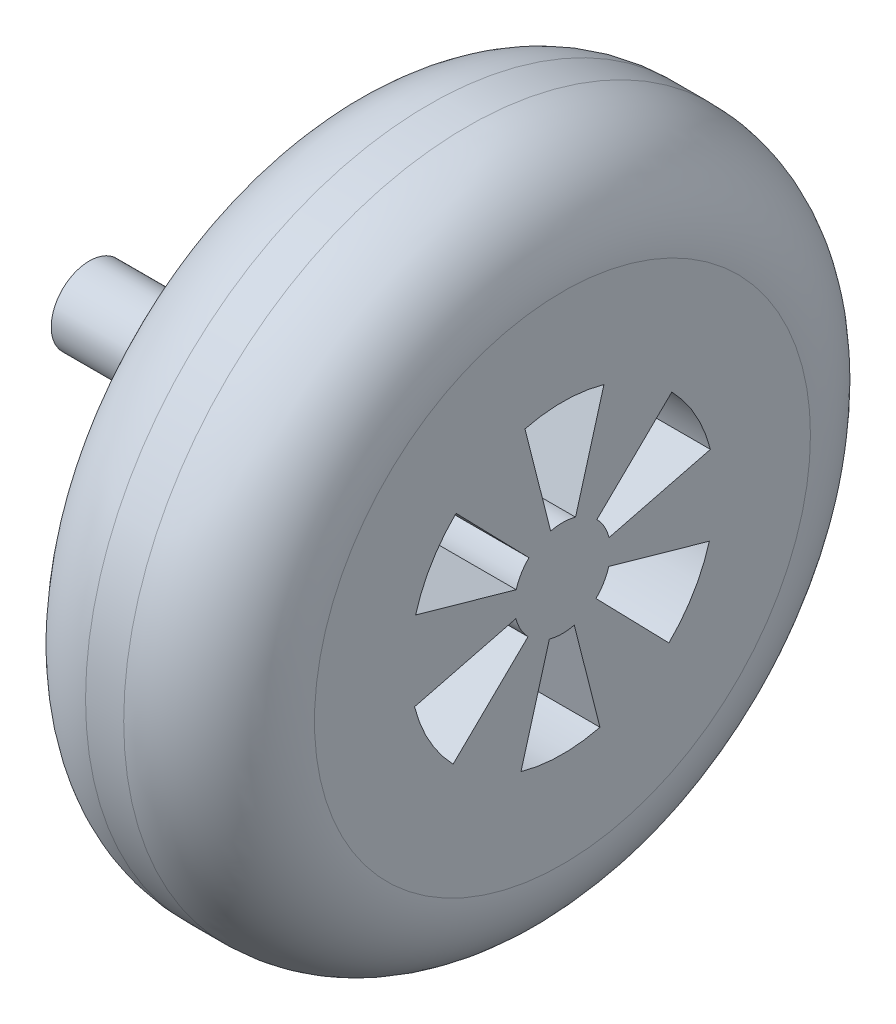
ISO-10303-21;
HEADER;
FILE_DESCRIPTION(('STEP AP214'),'2;1');
FILE_NAME('part.step','',(''),(''),'','','');
FILE_SCHEMA(('AUTOMOTIVE_DESIGN { 1 0 10303 214 1 1 1 1 }'));
ENDSEC;
DATA;
#1=APPLICATION_CONTEXT('core data for automotive mechanical design processes');
#2=APPLICATION_PROTOCOL_DEFINITION('international standard','automotive_design',2000,#1);
#3=PRODUCT_CONTEXT('',#1,'mechanical');
#4=PRODUCT('Part','Part','',(#3));
#5=PRODUCT_RELATED_PRODUCT_CATEGORY('part','',(#4));
#6=PRODUCT_DEFINITION_FORMATION('','',#4);
#7=PRODUCT_DEFINITION_CONTEXT('part definition',#1,'design');
#8=PRODUCT_DEFINITION('design','',#6,#7);
#9=PRODUCT_DEFINITION_SHAPE('','',#8);
#10=(LENGTH_UNIT() NAMED_UNIT(*) SI_UNIT(.MILLI.,.METRE.));
#11=(NAMED_UNIT(*) PLANE_ANGLE_UNIT() SI_UNIT($,.RADIAN.));
#12=(NAMED_UNIT(*) SI_UNIT($,.STERADIAN.) SOLID_ANGLE_UNIT());
#13=UNCERTAINTY_MEASURE_WITH_UNIT(LENGTH_MEASURE(1.E-05),#10,'distance_accuracy_value','');
#14=(GEOMETRIC_REPRESENTATION_CONTEXT(3) GLOBAL_UNCERTAINTY_ASSIGNED_CONTEXT((#13)) GLOBAL_UNIT_ASSIGNED_CONTEXT((#10,
#11,#12)) REPRESENTATION_CONTEXT('',''));
#15=CARTESIAN_POINT('',(0.,0.,0.));
#16=DIRECTION('',(0.,0.,1.));
#17=DIRECTION('',(1.,0.,0.));
#18=AXIS2_PLACEMENT_3D('',#15,#16,#17);
#19=CARTESIAN_POINT('',(60.,0.,0.));
#20=DIRECTION('',(-1.,0.,0.));
#21=DIRECTION('',(0.,0.,1.));
#22=AXIS2_PLACEMENT_3D('',#19,#20,#21);
#23=CYLINDRICAL_SURFACE('',#22,90.);
#24=CARTESIAN_POINT('',(35.,0.,0.));
#25=DIRECTION('',(1.,0.,0.));
#26=DIRECTION('',(0.,0.,-1.));
#27=AXIS2_PLACEMENT_3D('',#24,#25,#26);
#28=CIRCLE('',#27,90.);
#29=CARTESIAN_POINT('',(35.,0.,-90.));
#30=VERTEX_POINT('',#29);
#31=EDGE_CURVE('E385',#30,#30,#28,.F.);
#32=ORIENTED_EDGE('',*,*,#31,.T.);
#33=EDGE_LOOP('',(#32));
#34=FACE_BOUND('',#33,.T.);
#35=CARTESIAN_POINT('',(25.,0.,0.));
#36=DIRECTION('',(1.,0.,0.));
#37=DIRECTION('',(0.,0.,-1.));
#38=AXIS2_PLACEMENT_3D('',#35,#36,#37);
#39=CIRCLE('',#38,90.);
#40=CARTESIAN_POINT('',(25.,0.,-90.));
#41=VERTEX_POINT('',#40);
#42=EDGE_CURVE('E382',#41,#41,#39,.T.);
#43=ORIENTED_EDGE('',*,*,#42,.T.);
#44=EDGE_LOOP('',(#43));
#45=FACE_BOUND('',#44,.T.);
#46=ADVANCED_FACE('F136',(#34,#45),#23,.T.);
#47=CARTESIAN_POINT('',(60.,0.,0.));
#48=DIRECTION('',(1.,0.,0.));
#49=DIRECTION('',(0.,0.,-1.));
#50=AXIS2_PLACEMENT_3D('',#47,#48,#49);
#51=PLANE('',#50);
#52=DIRECTION('',(0.,0.962341280026266,-0.271844184704048));
#53=VECTOR('',#52,1.);
#54=CARTESIAN_POINT('',(60.,0.,0.));
#55=LINE('',#54,#53);
#56=CARTESIAN_POINT('',(60.,12.1213226702997,-3.424056670158));
#57=VERTEX_POINT('',#56);
#58=CARTESIAN_POINT('',(60.,38.4936512010506,-10.8737673881619));
#59=VERTEX_POINT('',#58);
#60=EDGE_CURVE('E340',#57,#59,#55,.T.);
#61=ORIENTED_EDGE('',*,*,#60,.F.);
#62=CARTESIAN_POINT('',(60.,0.,0.));
#63=DIRECTION('',(1.,0.,0.));
#64=DIRECTION('',(0.,0.,-1.));
#65=AXIS2_PLACEMENT_3D('',#62,#63,#64);
#66=CIRCLE('',#65,12.5956590680272);
#67=CARTESIAN_POINT('',(60.,12.2094016950268,3.0953412747955));
#68=VERTEX_POINT('',#67);
#69=EDGE_CURVE('E308',#57,#68,#66,.T.);
#70=ORIENTED_EDGE('',*,*,#69,.T.);
#71=DIRECTION('',(0.,0.969334087965204,0.24574667018836));
#72=VECTOR('',#71,1.);
#73=CARTESIAN_POINT('',(60.,0.,0.));
#74=LINE('',#73,#72);
#75=CARTESIAN_POINT('',(60.,38.7733635186082,9.82986680753438));
#76=VERTEX_POINT('',#75);
#77=EDGE_CURVE('E363',#68,#76,#74,.T.);
#78=ORIENTED_EDGE('',*,*,#77,.T.);
#79=CARTESIAN_POINT('',(60.,0.,0.));
#80=DIRECTION('',(1.,0.,0.));
#81=DIRECTION('',(0.,0.,-1.));
#82=AXIS2_PLACEMENT_3D('',#79,#80,#81);
#83=CIRCLE('',#82,40.);
#84=EDGE_CURVE('E370',#59,#76,#83,.T.);
#85=ORIENTED_EDGE('',*,*,#84,.F.);
#86=EDGE_LOOP('',(#61,#70,#78,#85));
#87=FACE_BOUND('',#86,.T.);
#88=DIRECTION('',(0.,0.716594609837904,0.69748990326116));
#89=VECTOR('',#88,1.);
#90=CARTESIAN_POINT('',(60.,1.15550426451895E-13,-1.18715428528426E-13));
#91=LINE('',#90,#89);
#92=CARTESIAN_POINT('',(60.,9.02598139550432,8.78534502486873));
#93=VERTEX_POINT('',#92);
#94=CARTESIAN_POINT('',(60.,28.6637843935163,27.8995961304463));
#95=VERTEX_POINT('',#94);
#96=EDGE_CURVE('E480',#93,#95,#91,.T.);
#97=ORIENTED_EDGE('',*,*,#96,.F.);
#98=CARTESIAN_POINT('',(60.,3.42405667015756,12.1213226702999));
#99=VERTEX_POINT('',#98);
#100=EDGE_CURVE('E620',#93,#99,#66,.T.);
#101=ORIENTED_EDGE('',*,*,#100,.T.);
#102=DIRECTION('',(0.,0.271844184704046,0.962341280026266));
#103=VECTOR('',#102,1.);
#104=CARTESIAN_POINT('',(60.,-4.12758163562285E-13,1.16596792408683E-13));
#105=LINE('',#104,#103);
#106=CARTESIAN_POINT('',(60.,10.8737673881612,38.49365120105));
#107=VERTEX_POINT('',#106);
#108=EDGE_CURVE('E474',#99,#107,#105,.T.);
#109=ORIENTED_EDGE('',*,*,#108,.T.);
#110=CARTESIAN_POINT('',(60.,0.,0.));
#111=DIRECTION('',(1.,0.,0.));
#112=DIRECTION('',(0.,0.,-1.));
#113=AXIS2_PLACEMENT_3D('',#110,#111,#112);
#114=CIRCLE('',#113,40.);
#115=EDGE_CURVE('E477',#95,#107,#114,.T.);
#116=ORIENTED_EDGE('',*,*,#115,.F.);
#117=EDGE_LOOP('',(#97,#101,#109,#116));
#118=FACE_BOUND('',#117,.T.);
#119=DIRECTION('',(0.,-0.245746670188359,0.969334087965204));
#120=VECTOR('',#119,1.);
#121=CARTESIAN_POINT('',(60.,-7.17171094242255E-13,-1.818180238924E-13));
#122=LINE('',#121,#120);
#123=CARTESIAN_POINT('',(60.,-3.09534127479621,12.2094016950266));
#124=VERTEX_POINT('',#123);
#125=CARTESIAN_POINT('',(60.,-9.82986680753507,38.773363518608));
#126=VERTEX_POINT('',#125);
#127=EDGE_CURVE('E460',#124,#126,#122,.T.);
#128=ORIENTED_EDGE('',*,*,#127,.F.);
#129=CARTESIAN_POINT('',(60.,-8.78534502486973,9.02598139550334));
#130=VERTEX_POINT('',#129);
#131=EDGE_CURVE('E622',#124,#130,#66,.T.);
#132=ORIENTED_EDGE('',*,*,#131,.T.);
#133=DIRECTION('',(0.,-0.697489903261158,0.716594609837906));
#134=VECTOR('',#133,1.);
#135=CARTESIAN_POINT('',(60.,-9.17402997423861E-13,-8.92944656769615E-13));
#136=LINE('',#135,#134);
#137=CARTESIAN_POINT('',(60.,-27.8995961304467,28.6637843935148));
#138=VERTEX_POINT('',#137);
#139=EDGE_CURVE('E454',#130,#138,#136,.T.);
#140=ORIENTED_EDGE('',*,*,#139,.T.);
#141=CARTESIAN_POINT('',(60.,0.,0.));
#142=DIRECTION('',(1.,0.,0.));
#143=DIRECTION('',(0.,0.,-1.));
#144=AXIS2_PLACEMENT_3D('',#141,#142,#143);
#145=CIRCLE('',#144,40.);
#146=EDGE_CURVE('E457',#126,#138,#145,.T.);
#147=ORIENTED_EDGE('',*,*,#146,.F.);
#148=EDGE_LOOP('',(#128,#132,#140,#147));
#149=FACE_BOUND('',#148,.T.);
#150=DIRECTION('',(0.,-0.962341280026266,0.271844184704048));
#151=VECTOR('',#150,1.);
#152=CARTESIAN_POINT('',(60.,-4.01309890150818E-13,-1.42065600481903E-12));
#153=LINE('',#152,#151);
#154=CARTESIAN_POINT('',(60.,-12.1213226703001,3.42405667015658));
#155=VERTEX_POINT('',#154);
#156=CARTESIAN_POINT('',(60.,-38.493651201051,10.8737673881605));
#157=VERTEX_POINT('',#156);
#158=EDGE_CURVE('E158',#155,#157,#153,.T.);
#159=ORIENTED_EDGE('',*,*,#158,.F.);
#160=CARTESIAN_POINT('',(60.,-12.2094016950264,-3.09534127479715));
#161=VERTEX_POINT('',#160);
#162=EDGE_CURVE('E152',#155,#161,#66,.T.);
#163=ORIENTED_EDGE('',*,*,#162,.T.);
#164=DIRECTION('',(0.,-0.969334087965204,-0.24574667018836));
#165=VECTOR('',#164,1.);
#166=CARTESIAN_POINT('',(60.,4.18842223855297E-13,-1.65209988298479E-12));
#167=LINE('',#166,#165);
#168=CARTESIAN_POINT('',(60.,-38.7733635186077,-9.82986680753604));
#169=VERTEX_POINT('',#168);
#170=EDGE_CURVE('E435',#161,#169,#167,.T.);
#171=ORIENTED_EDGE('',*,*,#170,.T.);
#172=CARTESIAN_POINT('',(60.,0.,0.));
#173=DIRECTION('',(1.,0.,0.));
#174=DIRECTION('',(0.,0.,-1.));
#175=AXIS2_PLACEMENT_3D('',#172,#173,#174);
#176=CIRCLE('',#175,40.);
#177=EDGE_CURVE('E438',#157,#169,#176,.T.);
#178=ORIENTED_EDGE('',*,*,#177,.F.);
#179=EDGE_LOOP('',(#159,#163,#171,#178));
#180=FACE_BOUND('',#179,.T.);
#181=DIRECTION('',(0.,-0.716594609837907,-0.697489903261157));
#182=VECTOR('',#181,1.);
#183=CARTESIAN_POINT('',(60.,1.02906426908205E-12,-1.05725101532384E-12));
#184=LINE('',#183,#182);
#185=CARTESIAN_POINT('',(60.,-9.02598139550322,-8.78534502486986));
#186=VERTEX_POINT('',#185);
#187=CARTESIAN_POINT('',(60.,-28.6637843935153,-27.8995961304473));
#188=VERTEX_POINT('',#187);
#189=EDGE_CURVE('E351',#186,#188,#184,.T.);
#190=ORIENTED_EDGE('',*,*,#189,.F.);
#191=CARTESIAN_POINT('',(60.,-3.42405667015675,-12.1213226703001));
#192=VERTEX_POINT('',#191);
#193=EDGE_CURVE('E310',#186,#192,#66,.T.);
#194=ORIENTED_EDGE('',*,*,#193,.T.);
#195=DIRECTION('',(0.,-0.271844184704046,-0.962341280026266));
#196=VECTOR('',#195,1.);
#197=CARTESIAN_POINT('',(60.,1.22951016163245E-12,-3.47314611158726E-13));
#198=LINE('',#197,#196);
#199=CARTESIAN_POINT('',(60.,-10.8737673881608,-38.4936512010517));
#200=VERTEX_POINT('',#199);
#201=EDGE_CURVE('E346',#192,#200,#198,.T.);
#202=ORIENTED_EDGE('',*,*,#201,.T.);
#203=CARTESIAN_POINT('',(60.,0.,0.));
#204=DIRECTION('',(1.,0.,0.));
#205=DIRECTION('',(0.,0.,-1.));
#206=AXIS2_PLACEMENT_3D('',#203,#204,#205);
#207=CIRCLE('',#206,40.);
#208=EDGE_CURVE('E353',#188,#200,#207,.T.);
#209=ORIENTED_EDGE('',*,*,#208,.F.);
#210=EDGE_LOOP('',(#190,#194,#202,#209));
#211=FACE_BOUND('',#210,.T.);
#212=CARTESIAN_POINT('',(60.,3.0953412747962,-12.2094016950266));
#213=VERTEX_POINT('',#212);
#214=CARTESIAN_POINT('',(60.,8.78534502486912,-9.02598139550394));
#215=VERTEX_POINT('',#214);
#216=EDGE_CURVE('E297',#213,#215,#66,.T.);
#217=ORIENTED_EDGE('',*,*,#216,.T.);
#218=DIRECTION('',(0.,0.697489903261157,-0.716594609837906));
#219=VECTOR('',#218,1.);
#220=CARTESIAN_POINT('',(60.,3.04557905648843E-13,2.96438266813761E-13));
#221=LINE('',#220,#219);
#222=CARTESIAN_POINT('',(60.,27.8995961304471,-28.6637843935165));
#223=VERTEX_POINT('',#222);
#224=EDGE_CURVE('E327',#215,#223,#221,.T.);
#225=ORIENTED_EDGE('',*,*,#224,.T.);
#226=CARTESIAN_POINT('',(60.,0.,0.));
#227=DIRECTION('',(1.,0.,0.));
#228=DIRECTION('',(0.,0.,-1.));
#229=AXIS2_PLACEMENT_3D('',#226,#227,#228);
#230=CIRCLE('',#229,40.);
#231=CARTESIAN_POINT('',(60.,9.82986680753505,-38.773363518608));
#232=VERTEX_POINT('',#231);
#233=EDGE_CURVE('E324',#232,#223,#230,.T.);
#234=ORIENTED_EDGE('',*,*,#233,.F.);
#235=DIRECTION('',(0.,0.245746670188358,-0.969334087965204));
#236=VECTOR('',#235,1.);
#237=CARTESIAN_POINT('',(60.,7.15069185994182E-13,1.81285145745002E-13));
#238=LINE('',#237,#236);
#239=EDGE_CURVE('E315',#213,#232,#238,.T.);
#240=ORIENTED_EDGE('',*,*,#239,.F.);
#241=EDGE_LOOP('',(#217,#225,#234,#240));
#242=FACE_BOUND('',#241,.T.);
#243=CARTESIAN_POINT('',(60.,0.,0.));
#244=DIRECTION('',(1.,0.,0.));
#245=DIRECTION('',(0.,0.,-1.));
#246=AXIS2_PLACEMENT_3D('',#243,#244,#245);
#247=CIRCLE('',#246,65.);
#248=CARTESIAN_POINT('',(60.,0.,-65.));
#249=VERTEX_POINT('',#248);
#250=EDGE_CURVE('E377',#249,#249,#247,.T.);
#251=ORIENTED_EDGE('',*,*,#250,.T.);
#252=EDGE_LOOP('',(#251));
#253=FACE_BOUND('',#252,.T.);
#254=ADVANCED_FACE('F321',(#87,#118,#149,#180,#211,#242,#253),#51,.T.);
#255=CARTESIAN_POINT('',(0.,0.,0.));
#256=DIRECTION('',(1.,0.,0.));
#257=DIRECTION('',(0.,0.,-1.));
#258=AXIS2_PLACEMENT_3D('',#255,#256,#257);
#259=PLANE('',#258);
#260=DIRECTION('',(0.,0.697489903261157,-0.716594609837906));
#261=VECTOR('',#260,1.);
#262=CARTESIAN_POINT('',(0.,3.04557905648843E-13,2.96438266813761E-13));
#263=LINE('',#262,#261);
#264=CARTESIAN_POINT('',(0.,8.78534502486912,-9.02598139550394));
#265=VERTEX_POINT('',#264);
#266=CARTESIAN_POINT('',(0.,27.8995961304466,-28.663784393516));
#267=VERTEX_POINT('',#266);
#268=EDGE_CURVE('E333',#265,#267,#263,.T.);
#269=ORIENTED_EDGE('',*,*,#268,.F.);
#270=CARTESIAN_POINT('',(0.,0.,0.));
#271=DIRECTION('',(1.,0.,0.));
#272=DIRECTION('',(0.,0.,-1.));
#273=AXIS2_PLACEMENT_3D('',#270,#271,#272);
#274=CIRCLE('',#273,12.5956590680272);
#275=CARTESIAN_POINT('',(0.,12.1213226702997,-3.424056670158));
#276=VERTEX_POINT('',#275);
#277=EDGE_CURVE('E422',#265,#276,#274,.T.);
#278=ORIENTED_EDGE('',*,*,#277,.T.);
#279=DIRECTION('',(0.,0.962341280026266,-0.271844184704048));
#280=VECTOR('',#279,1.);
#281=CARTESIAN_POINT('',(0.,0.,0.));
#282=LINE('',#281,#280);
#283=CARTESIAN_POINT('',(0.,38.4936512010506,-10.8737673881619));
#284=VERTEX_POINT('',#283);
#285=EDGE_CURVE('E360',#276,#284,#282,.T.);
#286=ORIENTED_EDGE('',*,*,#285,.T.);
#287=CARTESIAN_POINT('',(0.,0.,0.));
#288=DIRECTION('',(1.,0.,0.));
#289=DIRECTION('',(0.,0.,-1.));
#290=AXIS2_PLACEMENT_3D('',#287,#288,#289);
#291=CIRCLE('',#290,40.);
#292=CARTESIAN_POINT('',(0.,38.7733635186082,9.82986680753438));
#293=VERTEX_POINT('',#292);
#294=EDGE_CURVE('E362',#284,#293,#291,.T.);
#295=ORIENTED_EDGE('',*,*,#294,.T.);
#296=DIRECTION('',(0.,0.969334087965204,0.24574667018836));
#297=VECTOR('',#296,1.);
#298=CARTESIAN_POINT('',(0.,0.,0.));
#299=LINE('',#298,#297);
#300=CARTESIAN_POINT('',(0.,12.2094016950268,3.0953412747955));
#301=VERTEX_POINT('',#300);
#302=EDGE_CURVE('E366',#301,#293,#299,.T.);
#303=ORIENTED_EDGE('',*,*,#302,.F.);
#304=CARTESIAN_POINT('',(0.,9.02598139550432,8.78534502486873));
#305=VERTEX_POINT('',#304);
#306=EDGE_CURVE('E492',#301,#305,#274,.T.);
#307=ORIENTED_EDGE('',*,*,#306,.T.);
#308=DIRECTION('',(0.,0.716594609837904,0.69748990326116));
#309=VECTOR('',#308,1.);
#310=CARTESIAN_POINT('',(0.,1.15550426451895E-13,-1.18715428528426E-13));
#311=LINE('',#310,#309);
#312=CARTESIAN_POINT('',(0.,28.6637843935157,27.8995961304457));
#313=VERTEX_POINT('',#312);
#314=EDGE_CURVE('E476',#305,#313,#311,.T.);
#315=ORIENTED_EDGE('',*,*,#314,.T.);
#316=CARTESIAN_POINT('',(0.,0.,0.));
#317=DIRECTION('',(1.,0.,0.));
#318=DIRECTION('',(0.,0.,-1.));
#319=AXIS2_PLACEMENT_3D('',#316,#317,#318);
#320=CIRCLE('',#319,40.);
#321=CARTESIAN_POINT('',(0.,10.8737673881614,38.4936512010508));
#322=VERTEX_POINT('',#321);
#323=EDGE_CURVE('E484',#313,#322,#320,.T.);
#324=ORIENTED_EDGE('',*,*,#323,.T.);
#325=DIRECTION('',(0.,0.271844184704046,0.962341280026266));
#326=VECTOR('',#325,1.);
#327=CARTESIAN_POINT('',(0.,-4.12758163562285E-13,1.16596792408683E-13));
#328=LINE('',#327,#326);
#329=CARTESIAN_POINT('',(0.,3.42405667015757,12.1213226702999));
#330=VERTEX_POINT('',#329);
#331=EDGE_CURVE('E471',#330,#322,#328,.T.);
#332=ORIENTED_EDGE('',*,*,#331,.F.);
#333=CARTESIAN_POINT('',(0.,-3.09534127479621,12.2094016950266));
#334=VERTEX_POINT('',#333);
#335=EDGE_CURVE('E504',#330,#334,#274,.T.);
#336=ORIENTED_EDGE('',*,*,#335,.T.);
#337=DIRECTION('',(0.,-0.245746670188359,0.969334087965204));
#338=VECTOR('',#337,1.);
#339=CARTESIAN_POINT('',(0.,-7.17171094242255E-13,-1.818180238924E-13));
#340=LINE('',#339,#338);
#341=CARTESIAN_POINT('',(0.,-9.82986680753475,38.7733635186067));
#342=VERTEX_POINT('',#341);
#343=EDGE_CURVE('E456',#334,#342,#340,.T.);
#344=ORIENTED_EDGE('',*,*,#343,.T.);
#345=CARTESIAN_POINT('',(0.,0.,0.));
#346=DIRECTION('',(1.,0.,0.));
#347=DIRECTION('',(0.,0.,-1.));
#348=AXIS2_PLACEMENT_3D('',#345,#346,#347);
#349=CIRCLE('',#348,40.);
#350=CARTESIAN_POINT('',(0.,-27.8995961304472,28.6637843935154));
#351=VERTEX_POINT('',#350);
#352=EDGE_CURVE('E464',#342,#351,#349,.T.);
#353=ORIENTED_EDGE('',*,*,#352,.T.);
#354=DIRECTION('',(0.,-0.697489903261158,0.716594609837906));
#355=VECTOR('',#354,1.);
#356=CARTESIAN_POINT('',(0.,-9.17402997423861E-13,-8.92944656769615E-13));
#357=LINE('',#356,#355);
#358=CARTESIAN_POINT('',(0.,-8.78534502486973,9.02598139550334));
#359=VERTEX_POINT('',#358);
#360=EDGE_CURVE('E451',#359,#351,#357,.T.);
#361=ORIENTED_EDGE('',*,*,#360,.F.);
#362=CARTESIAN_POINT('',(0.,-12.1213226703001,3.42405667015658));
#363=VERTEX_POINT('',#362);
#364=EDGE_CURVE('E510',#359,#363,#274,.T.);
#365=ORIENTED_EDGE('',*,*,#364,.T.);
#366=DIRECTION('',(0.,-0.962341280026266,0.271844184704048));
#367=VECTOR('',#366,1.);
#368=CARTESIAN_POINT('',(0.,-4.01309890150818E-13,-1.42065600481903E-12));
#369=LINE('',#368,#367);
#370=CARTESIAN_POINT('',(0.,-38.4936512010502,10.8737673881603));
#371=VERTEX_POINT('',#370);
#372=EDGE_CURVE('E437',#363,#371,#369,.T.);
#373=ORIENTED_EDGE('',*,*,#372,.T.);
#374=CARTESIAN_POINT('',(0.,0.,0.));
#375=DIRECTION('',(1.,0.,0.));
#376=DIRECTION('',(0.,0.,-1.));
#377=AXIS2_PLACEMENT_3D('',#374,#375,#376);
#378=CIRCLE('',#377,40.);
#379=CARTESIAN_POINT('',(0.,-38.7733635186077,-9.82986680753604));
#380=VERTEX_POINT('',#379);
#381=EDGE_CURVE('E444',#371,#380,#378,.T.);
#382=ORIENTED_EDGE('',*,*,#381,.T.);
#383=DIRECTION('',(0.,-0.969334087965204,-0.24574667018836));
#384=VECTOR('',#383,1.);
#385=CARTESIAN_POINT('',(0.,4.18842223855297E-13,-1.65209988298479E-12));
#386=LINE('',#385,#384);
#387=CARTESIAN_POINT('',(0.,-12.2094016950264,-3.09534127479715));
#388=VERTEX_POINT('',#387);
#389=EDGE_CURVE('E432',#388,#380,#386,.T.);
#390=ORIENTED_EDGE('',*,*,#389,.F.);
#391=CARTESIAN_POINT('',(0.,-9.02598139550322,-8.78534502486986));
#392=VERTEX_POINT('',#391);
#393=EDGE_CURVE('E516',#388,#392,#274,.T.);
#394=ORIENTED_EDGE('',*,*,#393,.T.);
#395=DIRECTION('',(0.,-0.716594609837907,-0.697489903261157));
#396=VECTOR('',#395,1.);
#397=CARTESIAN_POINT('',(0.,1.02906426908205E-12,-1.05725101532384E-12));
#398=LINE('',#397,#396);
#399=CARTESIAN_POINT('',(0.,-28.6637843935153,-27.8995961304473));
#400=VERTEX_POINT('',#399);
#401=EDGE_CURVE('E343',#392,#400,#398,.T.);
#402=ORIENTED_EDGE('',*,*,#401,.T.);
#403=CARTESIAN_POINT('',(0.,0.,0.));
#404=DIRECTION('',(1.,0.,0.));
#405=DIRECTION('',(0.,0.,-1.));
#406=AXIS2_PLACEMENT_3D('',#403,#404,#405);
#407=CIRCLE('',#406,40.);
#408=CARTESIAN_POINT('',(0.,-10.8737673881606,-38.493651201051));
#409=VERTEX_POINT('',#408);
#410=EDGE_CURVE('E345',#400,#409,#407,.T.);
#411=ORIENTED_EDGE('',*,*,#410,.T.);
#412=DIRECTION('',(0.,-0.271844184704046,-0.962341280026266));
#413=VECTOR('',#412,1.);
#414=CARTESIAN_POINT('',(0.,1.22951016163245E-12,-3.47314611158726E-13));
#415=LINE('',#414,#413);
#416=CARTESIAN_POINT('',(0.,-3.42405667015675,-12.1213226703001));
#417=VERTEX_POINT('',#416);
#418=EDGE_CURVE('E349',#417,#409,#415,.T.);
#419=ORIENTED_EDGE('',*,*,#418,.F.);
#420=CARTESIAN_POINT('',(0.,3.0953412747962,-12.2094016950266));
#421=VERTEX_POINT('',#420);
#422=EDGE_CURVE('E318',#417,#421,#274,.T.);
#423=ORIENTED_EDGE('',*,*,#422,.T.);
#424=DIRECTION('',(0.,0.245746670188358,-0.969334087965204));
#425=VECTOR('',#424,1.);
#426=CARTESIAN_POINT('',(0.,7.15069185994182E-13,1.81285145745002E-13));
#427=LINE('',#426,#425);
#428=CARTESIAN_POINT('',(0.,9.82986680753515,-38.7733635186084));
#429=VERTEX_POINT('',#428);
#430=EDGE_CURVE('E317',#421,#429,#427,.T.);
#431=ORIENTED_EDGE('',*,*,#430,.T.);
#432=CARTESIAN_POINT('',(0.,0.,0.));
#433=DIRECTION('',(1.,0.,0.));
#434=DIRECTION('',(0.,0.,-1.));
#435=AXIS2_PLACEMENT_3D('',#432,#433,#434);
#436=CIRCLE('',#435,40.);
#437=EDGE_CURVE('E425',#429,#267,#436,.T.);
#438=ORIENTED_EDGE('',*,*,#437,.T.);
#439=EDGE_LOOP('',(#269,#278,#286,#295,#303,#307,#315,#324,#332,#336,#344,#353,#361,#365,#373,
#382,#390,#394,#402,#411,#419,#423,#431,#438));
#440=FACE_BOUND('',#439,.T.);
#441=CARTESIAN_POINT('',(0.,0.,0.));
#442=DIRECTION('',(1.,0.,0.));
#443=DIRECTION('',(0.,0.,-1.));
#444=AXIS2_PLACEMENT_3D('',#441,#442,#443);
#445=CIRCLE('',#444,65.);
#446=CARTESIAN_POINT('',(0.,0.,-65.));
#447=VERTEX_POINT('',#446);
#448=EDGE_CURVE('E145',#447,#447,#445,.F.);
#449=ORIENTED_EDGE('',*,*,#448,.T.);
#450=EDGE_LOOP('',(#449));
#451=FACE_BOUND('',#450,.T.);
#452=ADVANCED_FACE('F391',(#440,#451),#259,.F.);
#453=CARTESIAN_POINT('',(35.,0.,0.));
#454=DIRECTION('',(1.,0.,0.));
#455=DIRECTION('',(0.,0.,-1.));
#456=AXIS2_PLACEMENT_3D('',#453,#454,#455);
#457=TOROIDAL_SURFACE('',#456,65.,25.);
#458=ORIENTED_EDGE('',*,*,#31,.F.);
#459=EDGE_LOOP('',(#458));
#460=FACE_BOUND('',#459,.T.);
#461=ORIENTED_EDGE('',*,*,#250,.F.);
#462=EDGE_LOOP('',(#461));
#463=FACE_BOUND('',#462,.T.);
#464=ADVANCED_FACE('F396',(#460,#463),#457,.T.);
#465=CARTESIAN_POINT('',(25.,0.,0.));
#466=DIRECTION('',(1.,0.,0.));
#467=DIRECTION('',(0.,0.,-1.));
#468=AXIS2_PLACEMENT_3D('',#465,#466,#467);
#469=TOROIDAL_SURFACE('',#468,65.,25.);
#470=ORIENTED_EDGE('',*,*,#448,.F.);
#471=EDGE_LOOP('',(#470));
#472=FACE_BOUND('',#471,.T.);
#473=ORIENTED_EDGE('',*,*,#42,.F.);
#474=EDGE_LOOP('',(#473));
#475=FACE_BOUND('',#474,.T.);
#476=ADVANCED_FACE('F138',(#472,#475),#469,.T.);
#477=CARTESIAN_POINT('',(0.,0.,0.));
#478=DIRECTION('',(0.,-0.271844184704048,-0.962341280026266));
#479=DIRECTION('',(0.,0.962341280026266,-0.271844184704048));
#480=AXIS2_PLACEMENT_3D('',#477,#478,#479);
#481=PLANE('',#480);
#482=ORIENTED_EDGE('',*,*,#285,.F.);
#483=DIRECTION('',(1.,0.,0.));
#484=VECTOR('',#483,1.);
#485=CARTESIAN_POINT('',(-0.999999999999945,12.1213226702997,-3.424056670158));
#486=LINE('',#485,#484);
#487=EDGE_CURVE('E496',#276,#57,#486,.T.);
#488=ORIENTED_EDGE('',*,*,#487,.T.);
#489=ORIENTED_EDGE('',*,*,#60,.T.);
#490=DIRECTION('',(1.,0.,0.));
#491=VECTOR('',#490,1.);
#492=CARTESIAN_POINT('',(0.,38.4936512010506,-10.8737673881619));
#493=LINE('',#492,#491);
#494=EDGE_CURVE('E368',#284,#59,#493,.T.);
#495=ORIENTED_EDGE('',*,*,#494,.F.);
#496=EDGE_LOOP('',(#482,#488,#489,#495));
#497=FACE_BOUND('',#496,.T.);
#498=ADVANCED_FACE('F395',(#497),#481,.F.);
#499=CARTESIAN_POINT('',(0.,0.,0.));
#500=DIRECTION('',(0.,0.24574667018836,-0.969334087965204));
#501=DIRECTION('',(0.,0.969334087965204,0.24574667018836));
#502=AXIS2_PLACEMENT_3D('',#499,#500,#501);
#503=PLANE('',#502);
#504=DIRECTION('',(1.,0.,0.));
#505=VECTOR('',#504,1.);
#506=CARTESIAN_POINT('',(-0.999999999999945,12.2094016950268,3.0953412747955));
#507=LINE('',#506,#505);
#508=EDGE_CURVE('E490',#301,#68,#507,.T.);
#509=ORIENTED_EDGE('',*,*,#508,.F.);
#510=ORIENTED_EDGE('',*,*,#302,.T.);
#511=DIRECTION('',(1.,0.,0.));
#512=VECTOR('',#511,1.);
#513=CARTESIAN_POINT('',(0.,38.7733635186082,9.82986680753438));
#514=LINE('',#513,#512);
#515=EDGE_CURVE('E374',#293,#76,#514,.T.);
#516=ORIENTED_EDGE('',*,*,#515,.T.);
#517=ORIENTED_EDGE('',*,*,#77,.F.);
#518=EDGE_LOOP('',(#509,#510,#516,#517));
#519=FACE_BOUND('',#518,.T.);
#520=ADVANCED_FACE('F598',(#519),#503,.T.);
#521=CARTESIAN_POINT('',(0.,0.,0.));
#522=DIRECTION('',(1.,0.,0.));
#523=DIRECTION('',(0.,0.,-1.));
#524=AXIS2_PLACEMENT_3D('',#521,#522,#523);
#525=CYLINDRICAL_SURFACE('',#524,40.);
#526=ORIENTED_EDGE('',*,*,#84,.T.);
#527=ORIENTED_EDGE('',*,*,#515,.F.);
#528=ORIENTED_EDGE('',*,*,#294,.F.);
#529=ORIENTED_EDGE('',*,*,#494,.T.);
#530=EDGE_LOOP('',(#526,#527,#528,#529));
#531=FACE_BOUND('',#530,.T.);
#532=ADVANCED_FACE('F550',(#531),#525,.F.);
#533=CARTESIAN_POINT('',(0.,1.15550426451895E-13,-1.18715428528426E-13));
#534=DIRECTION('',(0.,0.69748990326116,-0.716594609837904));
#535=DIRECTION('',(0.,0.716594609837904,0.69748990326116));
#536=AXIS2_PLACEMENT_3D('',#533,#534,#535);
#537=PLANE('',#536);
#538=ORIENTED_EDGE('',*,*,#314,.F.);
#539=DIRECTION('',(1.,0.,0.));
#540=VECTOR('',#539,1.);
#541=CARTESIAN_POINT('',(-0.999999999999945,9.02598139550432,8.78534502486873));
#542=LINE('',#541,#540);
#543=EDGE_CURVE('E493',#305,#93,#542,.T.);
#544=ORIENTED_EDGE('',*,*,#543,.T.);
#545=ORIENTED_EDGE('',*,*,#96,.T.);
#546=DIRECTION('',(1.,0.,0.));
#547=VECTOR('',#546,1.);
#548=CARTESIAN_POINT('',(0.,28.6637843935157,27.8995961304457));
#549=LINE('',#548,#547);
#550=EDGE_CURVE('E468',#313,#95,#549,.T.);
#551=ORIENTED_EDGE('',*,*,#550,.F.);
#552=EDGE_LOOP('',(#538,#544,#545,#551));
#553=FACE_BOUND('',#552,.T.);
#554=ADVANCED_FACE('F543',(#553),#537,.F.);
#555=CARTESIAN_POINT('',(0.,-4.12758163562285E-13,1.16596792408683E-13));
#556=DIRECTION('',(0.,0.962341280026266,-0.271844184704046));
#557=DIRECTION('',(0.,0.271844184704046,0.962341280026266));
#558=AXIS2_PLACEMENT_3D('',#555,#556,#557);
#559=PLANE('',#558);
#560=DIRECTION('',(1.,0.,0.));
#561=VECTOR('',#560,1.);
#562=CARTESIAN_POINT('',(-0.999999999999945,3.42405667015756,12.1213226702999));
#563=LINE('',#562,#561);
#564=EDGE_CURVE('E502',#330,#99,#563,.T.);
#565=ORIENTED_EDGE('',*,*,#564,.F.);
#566=ORIENTED_EDGE('',*,*,#331,.T.);
#567=DIRECTION('',(1.,0.,0.));
#568=VECTOR('',#567,1.);
#569=CARTESIAN_POINT('',(0.,10.8737673881612,38.49365120105));
#570=LINE('',#569,#568);
#571=EDGE_CURVE('E462',#322,#107,#570,.T.);
#572=ORIENTED_EDGE('',*,*,#571,.T.);
#573=ORIENTED_EDGE('',*,*,#108,.F.);
#574=EDGE_LOOP('',(#565,#566,#572,#573));
#575=FACE_BOUND('',#574,.T.);
#576=ADVANCED_FACE('F539',(#575),#559,.T.);
#577=CARTESIAN_POINT('',(0.,0.,0.));
#578=DIRECTION('',(1.,0.,0.));
#579=DIRECTION('',(0.,0.,-1.));
#580=AXIS2_PLACEMENT_3D('',#577,#578,#579);
#581=CYLINDRICAL_SURFACE('',#580,40.);
#582=ORIENTED_EDGE('',*,*,#115,.T.);
#583=ORIENTED_EDGE('',*,*,#571,.F.);
#584=ORIENTED_EDGE('',*,*,#323,.F.);
#585=ORIENTED_EDGE('',*,*,#550,.T.);
#586=EDGE_LOOP('',(#582,#583,#584,#585));
#587=FACE_BOUND('',#586,.T.);
#588=ADVANCED_FACE('F542',(#587),#581,.F.);
#589=CARTESIAN_POINT('',(0.,7.15069185994182E-13,1.81285145745002E-13));
#590=DIRECTION('',(0.,-0.969334087965204,-0.245746670188358));
#591=DIRECTION('',(0.,0.245746670188358,-0.969334087965204));
#592=AXIS2_PLACEMENT_3D('',#589,#590,#591);
#593=PLANE('',#592);
#594=ORIENTED_EDGE('',*,*,#430,.F.);
#595=DIRECTION('',(1.,0.,0.));
#596=VECTOR('',#595,1.);
#597=CARTESIAN_POINT('',(-0.999999999999945,3.0953412747962,-12.2094016950266));
#598=LINE('',#597,#596);
#599=EDGE_CURVE('E300',#421,#213,#598,.T.);
#600=ORIENTED_EDGE('',*,*,#599,.T.);
#601=ORIENTED_EDGE('',*,*,#239,.T.);
#602=DIRECTION('',(1.,0.,0.));
#603=VECTOR('',#602,1.);
#604=CARTESIAN_POINT('',(0.,9.82986680753515,-38.7733635186084));
#605=LINE('',#604,#603);
#606=EDGE_CURVE('E341',#429,#232,#605,.T.);
#607=ORIENTED_EDGE('',*,*,#606,.F.);
#608=EDGE_LOOP('',(#594,#600,#601,#607));
#609=FACE_BOUND('',#608,.T.);
#610=ADVANCED_FACE('F313',(#609),#593,.F.);
#611=CARTESIAN_POINT('',(0.,3.04557905648843E-13,2.96438266813761E-13));
#612=DIRECTION('',(0.,-0.716594609837906,-0.697489903261157));
#613=DIRECTION('',(0.,0.697489903261157,-0.716594609837906));
#614=AXIS2_PLACEMENT_3D('',#611,#612,#613);
#615=PLANE('',#614);
#616=DIRECTION('',(1.,0.,0.));
#617=VECTOR('',#616,1.);
#618=CARTESIAN_POINT('',(-0.999999999999945,8.78534502486912,-9.02598139550394));
#619=LINE('',#618,#617);
#620=EDGE_CURVE('E303',#265,#215,#619,.T.);
#621=ORIENTED_EDGE('',*,*,#620,.F.);
#622=ORIENTED_EDGE('',*,*,#268,.T.);
#623=DIRECTION('',(1.,0.,0.));
#624=VECTOR('',#623,1.);
#625=CARTESIAN_POINT('',(0.,27.8995961304471,-28.6637843935165));
#626=LINE('',#625,#624);
#627=EDGE_CURVE('E337',#267,#223,#626,.T.);
#628=ORIENTED_EDGE('',*,*,#627,.T.);
#629=ORIENTED_EDGE('',*,*,#224,.F.);
#630=EDGE_LOOP('',(#621,#622,#628,#629));
#631=FACE_BOUND('',#630,.T.);
#632=ADVANCED_FACE('F578',(#631),#615,.T.);
#633=CARTESIAN_POINT('',(0.,0.,0.));
#634=DIRECTION('',(1.,0.,0.));
#635=DIRECTION('',(0.,0.,-1.));
#636=AXIS2_PLACEMENT_3D('',#633,#634,#635);
#637=CYLINDRICAL_SURFACE('',#636,40.);
#638=ORIENTED_EDGE('',*,*,#233,.T.);
#639=ORIENTED_EDGE('',*,*,#627,.F.);
#640=ORIENTED_EDGE('',*,*,#437,.F.);
#641=ORIENTED_EDGE('',*,*,#606,.T.);
#642=EDGE_LOOP('',(#638,#639,#640,#641));
#643=FACE_BOUND('',#642,.T.);
#644=ADVANCED_FACE('F581',(#643),#637,.F.);
#645=CARTESIAN_POINT('',(0.,1.02906426908205E-12,-1.05725101532384E-12));
#646=DIRECTION('',(0.,-0.697489903261156,0.716594609837907));
#647=DIRECTION('',(0.,-0.716594609837907,-0.697489903261157));
#648=AXIS2_PLACEMENT_3D('',#645,#646,#647);
#649=PLANE('',#648);
#650=ORIENTED_EDGE('',*,*,#401,.F.);
#651=DIRECTION('',(1.,0.,0.));
#652=VECTOR('',#651,1.);
#653=CARTESIAN_POINT('',(-0.999999999999945,-9.02598139550322,-8.78534502486986));
#654=LINE('',#653,#652);
#655=EDGE_CURVE('E513',#392,#186,#654,.T.);
#656=ORIENTED_EDGE('',*,*,#655,.T.);
#657=ORIENTED_EDGE('',*,*,#189,.T.);
#658=DIRECTION('',(1.,0.,0.));
#659=VECTOR('',#658,1.);
#660=CARTESIAN_POINT('',(0.,-28.6637843935153,-27.8995961304473));
#661=LINE('',#660,#659);
#662=EDGE_CURVE('E330',#400,#188,#661,.T.);
#663=ORIENTED_EDGE('',*,*,#662,.F.);
#664=EDGE_LOOP('',(#650,#656,#657,#663));
#665=FACE_BOUND('',#664,.T.);
#666=ADVANCED_FACE('F584',(#665),#649,.F.);
#667=CARTESIAN_POINT('',(0.,1.22951016163245E-12,-3.47314611158726E-13));
#668=DIRECTION('',(0.,-0.962341280026266,0.271844184704046));
#669=DIRECTION('',(0.,-0.271844184704046,-0.962341280026266));
#670=AXIS2_PLACEMENT_3D('',#667,#668,#669);
#671=PLANE('',#670);
#672=DIRECTION('',(1.,0.,0.));
#673=VECTOR('',#672,1.);
#674=CARTESIAN_POINT('',(-0.999999999999945,-3.42405667015675,-12.1213226703001));
#675=LINE('',#674,#673);
#676=EDGE_CURVE('E500',#417,#192,#675,.T.);
#677=ORIENTED_EDGE('',*,*,#676,.F.);
#678=ORIENTED_EDGE('',*,*,#418,.T.);
#679=DIRECTION('',(1.,0.,0.));
#680=VECTOR('',#679,1.);
#681=CARTESIAN_POINT('',(0.,-10.8737673881608,-38.4936512010517));
#682=LINE('',#681,#680);
#683=EDGE_CURVE('E325',#409,#200,#682,.T.);
#684=ORIENTED_EDGE('',*,*,#683,.T.);
#685=ORIENTED_EDGE('',*,*,#201,.F.);
#686=EDGE_LOOP('',(#677,#678,#684,#685));
#687=FACE_BOUND('',#686,.T.);
#688=ADVANCED_FACE('F588',(#687),#671,.T.);
#689=CARTESIAN_POINT('',(0.,0.,0.));
#690=DIRECTION('',(1.,0.,0.));
#691=DIRECTION('',(0.,0.,-1.));
#692=AXIS2_PLACEMENT_3D('',#689,#690,#691);
#693=CYLINDRICAL_SURFACE('',#692,40.);
#694=ORIENTED_EDGE('',*,*,#208,.T.);
#695=ORIENTED_EDGE('',*,*,#683,.F.);
#696=ORIENTED_EDGE('',*,*,#410,.F.);
#697=ORIENTED_EDGE('',*,*,#662,.T.);
#698=EDGE_LOOP('',(#694,#695,#696,#697));
#699=FACE_BOUND('',#698,.T.);
#700=ADVANCED_FACE('F564',(#699),#693,.F.);
#701=CARTESIAN_POINT('',(0.,-7.17171094242255E-13,-1.818180238924E-13));
#702=DIRECTION('',(0.,0.969334087965204,0.245746670188359));
#703=DIRECTION('',(0.,-0.245746670188359,0.969334087965204));
#704=AXIS2_PLACEMENT_3D('',#701,#702,#703);
#705=PLANE('',#704);
#706=ORIENTED_EDGE('',*,*,#343,.F.);
#707=DIRECTION('',(1.,0.,0.));
#708=VECTOR('',#707,1.);
#709=CARTESIAN_POINT('',(-0.999999999999945,-3.09534127479621,12.2094016950266));
#710=LINE('',#709,#708);
#711=EDGE_CURVE('E505',#334,#124,#710,.T.);
#712=ORIENTED_EDGE('',*,*,#711,.T.);
#713=ORIENTED_EDGE('',*,*,#127,.T.);
#714=DIRECTION('',(1.,0.,0.));
#715=VECTOR('',#714,1.);
#716=CARTESIAN_POINT('',(0.,-9.82986680753475,38.7733635186067));
#717=LINE('',#716,#715);
#718=EDGE_CURVE('E448',#342,#126,#717,.T.);
#719=ORIENTED_EDGE('',*,*,#718,.F.);
#720=EDGE_LOOP('',(#706,#712,#713,#719));
#721=FACE_BOUND('',#720,.T.);
#722=ADVANCED_FACE('F556',(#721),#705,.F.);
#723=CARTESIAN_POINT('',(0.,-9.17402997423861E-13,-8.92944656769615E-13));
#724=DIRECTION('',(0.,0.716594609837906,0.697489903261158));
#725=DIRECTION('',(0.,-0.697489903261158,0.716594609837906));
#726=AXIS2_PLACEMENT_3D('',#723,#724,#725);
#727=PLANE('',#726);
#728=DIRECTION('',(1.,0.,0.));
#729=VECTOR('',#728,1.);
#730=CARTESIAN_POINT('',(-0.999999999999945,-8.78534502486973,9.02598139550334));
#731=LINE('',#730,#729);
#732=EDGE_CURVE('E508',#359,#130,#731,.T.);
#733=ORIENTED_EDGE('',*,*,#732,.F.);
#734=ORIENTED_EDGE('',*,*,#360,.T.);
#735=DIRECTION('',(1.,0.,0.));
#736=VECTOR('',#735,1.);
#737=CARTESIAN_POINT('',(0.,-27.8995961304467,28.6637843935148));
#738=LINE('',#737,#736);
#739=EDGE_CURVE('E442',#351,#138,#738,.T.);
#740=ORIENTED_EDGE('',*,*,#739,.T.);
#741=ORIENTED_EDGE('',*,*,#139,.F.);
#742=EDGE_LOOP('',(#733,#734,#740,#741));
#743=FACE_BOUND('',#742,.T.);
#744=ADVANCED_FACE('F552',(#743),#727,.T.);
#745=CARTESIAN_POINT('',(0.,0.,0.));
#746=DIRECTION('',(1.,0.,0.));
#747=DIRECTION('',(0.,0.,-1.));
#748=AXIS2_PLACEMENT_3D('',#745,#746,#747);
#749=CYLINDRICAL_SURFACE('',#748,40.);
#750=ORIENTED_EDGE('',*,*,#146,.T.);
#751=ORIENTED_EDGE('',*,*,#739,.F.);
#752=ORIENTED_EDGE('',*,*,#352,.F.);
#753=ORIENTED_EDGE('',*,*,#718,.T.);
#754=EDGE_LOOP('',(#750,#751,#752,#753));
#755=FACE_BOUND('',#754,.T.);
#756=ADVANCED_FACE('F555',(#755),#749,.F.);
#757=CARTESIAN_POINT('',(0.,-4.01309890150818E-13,-1.42065600481903E-12));
#758=DIRECTION('',(0.,0.271844184704048,0.962341280026266));
#759=DIRECTION('',(0.,-0.962341280026266,0.271844184704048));
#760=AXIS2_PLACEMENT_3D('',#757,#758,#759);
#761=PLANE('',#760);
#762=ORIENTED_EDGE('',*,*,#372,.F.);
#763=DIRECTION('',(1.,0.,0.));
#764=VECTOR('',#763,1.);
#765=CARTESIAN_POINT('',(-0.999999999999945,-12.1213226703001,3.42405667015658));
#766=LINE('',#765,#764);
#767=EDGE_CURVE('E511',#363,#155,#766,.T.);
#768=ORIENTED_EDGE('',*,*,#767,.T.);
#769=ORIENTED_EDGE('',*,*,#158,.T.);
#770=DIRECTION('',(1.,0.,0.));
#771=VECTOR('',#770,1.);
#772=CARTESIAN_POINT('',(0.,-38.4936512010502,10.8737673881603));
#773=LINE('',#772,#771);
#774=EDGE_CURVE('E430',#371,#157,#773,.T.);
#775=ORIENTED_EDGE('',*,*,#774,.F.);
#776=EDGE_LOOP('',(#762,#768,#769,#775));
#777=FACE_BOUND('',#776,.T.);
#778=ADVANCED_FACE('F560',(#777),#761,.F.);
#779=CARTESIAN_POINT('',(0.,4.18842223855297E-13,-1.65209988298479E-12));
#780=DIRECTION('',(0.,-0.24574667018836,0.969334087965204));
#781=DIRECTION('',(0.,-0.969334087965204,-0.24574667018836));
#782=AXIS2_PLACEMENT_3D('',#779,#780,#781);
#783=PLANE('',#782);
#784=DIRECTION('',(1.,0.,0.));
#785=VECTOR('',#784,1.);
#786=CARTESIAN_POINT('',(-0.999999999999945,-12.2094016950264,-3.09534127479715));
#787=LINE('',#786,#785);
#788=EDGE_CURVE('E12',#388,#161,#787,.T.);
#789=ORIENTED_EDGE('',*,*,#788,.F.);
#790=ORIENTED_EDGE('',*,*,#389,.T.);
#791=DIRECTION('',(1.,0.,0.));
#792=VECTOR('',#791,1.);
#793=CARTESIAN_POINT('',(0.,-38.7733635186077,-9.82986680753604));
#794=LINE('',#793,#792);
#795=EDGE_CURVE('E354',#380,#169,#794,.T.);
#796=ORIENTED_EDGE('',*,*,#795,.T.);
#797=ORIENTED_EDGE('',*,*,#170,.F.);
#798=EDGE_LOOP('',(#789,#790,#796,#797));
#799=FACE_BOUND('',#798,.T.);
#800=ADVANCED_FACE('F569',(#799),#783,.T.);
#801=CARTESIAN_POINT('',(0.,0.,0.));
#802=DIRECTION('',(1.,0.,0.));
#803=DIRECTION('',(0.,0.,-1.));
#804=AXIS2_PLACEMENT_3D('',#801,#802,#803);
#805=CYLINDRICAL_SURFACE('',#804,40.);
#806=ORIENTED_EDGE('',*,*,#177,.T.);
#807=ORIENTED_EDGE('',*,*,#795,.F.);
#808=ORIENTED_EDGE('',*,*,#381,.F.);
#809=ORIENTED_EDGE('',*,*,#774,.T.);
#810=EDGE_LOOP('',(#806,#807,#808,#809));
#811=FACE_BOUND('',#810,.T.);
#812=ADVANCED_FACE('F535',(#811),#805,.F.);
#813=CARTESIAN_POINT('',(-0.999999999999945,0.,0.));
#814=DIRECTION('',(1.,0.,0.));
#815=DIRECTION('',(0.,0.,-1.));
#816=AXIS2_PLACEMENT_3D('',#813,#814,#815);
#817=CYLINDRICAL_SURFACE('',#816,12.5956590680272);
#818=CARTESIAN_POINT('',(-0.999999999999945,0.,0.));
#819=DIRECTION('',(1.,0.,0.));
#820=DIRECTION('',(0.,0.,-1.));
#821=AXIS2_PLACEMENT_3D('',#818,#819,#820);
#822=CIRCLE('',#821,12.5956590680272);
#823=CARTESIAN_POINT('',(-0.999999999999945,0.,-12.5956590680272));
#824=VERTEX_POINT('',#823);
#825=EDGE_CURVE('E307',#824,#824,#822,.T.);
#826=ORIENTED_EDGE('',*,*,#825,.T.);
#827=EDGE_LOOP('',(#826));
#828=FACE_BOUND('',#827,.T.);
#829=ORIENTED_EDGE('',*,*,#306,.F.);
#830=ORIENTED_EDGE('',*,*,#508,.T.);
#831=ORIENTED_EDGE('',*,*,#69,.F.);
#832=ORIENTED_EDGE('',*,*,#487,.F.);
#833=ORIENTED_EDGE('',*,*,#277,.F.);
#834=ORIENTED_EDGE('',*,*,#620,.T.);
#835=ORIENTED_EDGE('',*,*,#216,.F.);
#836=ORIENTED_EDGE('',*,*,#599,.F.);
#837=ORIENTED_EDGE('',*,*,#422,.F.);
#838=ORIENTED_EDGE('',*,*,#676,.T.);
#839=ORIENTED_EDGE('',*,*,#193,.F.);
#840=ORIENTED_EDGE('',*,*,#655,.F.);
#841=ORIENTED_EDGE('',*,*,#393,.F.);
#842=ORIENTED_EDGE('',*,*,#788,.T.);
#843=ORIENTED_EDGE('',*,*,#162,.F.);
#844=ORIENTED_EDGE('',*,*,#767,.F.);
#845=ORIENTED_EDGE('',*,*,#364,.F.);
#846=ORIENTED_EDGE('',*,*,#732,.T.);
#847=ORIENTED_EDGE('',*,*,#131,.F.);
#848=ORIENTED_EDGE('',*,*,#711,.F.);
#849=ORIENTED_EDGE('',*,*,#335,.F.);
#850=ORIENTED_EDGE('',*,*,#564,.T.);
#851=ORIENTED_EDGE('',*,*,#100,.F.);
#852=ORIENTED_EDGE('',*,*,#543,.F.);
#853=EDGE_LOOP('',(#829,#830,#831,#832,#833,#834,#835,#836,#837,#838,#839,#840,#841,#842,#843,
#844,#845,#846,#847,#848,#849,#850,#851,#852));
#854=FACE_BOUND('',#853,.T.);
#855=ADVANCED_FACE('F299',(#828,#854),#817,.T.);
#856=CARTESIAN_POINT('',(-0.999999999999945,0.,0.));
#857=DIRECTION('',(1.,0.,0.));
#858=DIRECTION('',(0.,0.,-1.));
#859=AXIS2_PLACEMENT_3D('',#856,#857,#858);
#860=PLANE('',#859);
#861=CARTESIAN_POINT('',(-0.999999999999945,0.,0.));
#862=DIRECTION('',(1.,0.,0.));
#863=DIRECTION('',(0.,0.,-1.));
#864=AXIS2_PLACEMENT_3D('',#861,#862,#863);
#865=CIRCLE('',#864,10.);
#866=CARTESIAN_POINT('',(-0.999999999999945,0.,-10.));
#867=VERTEX_POINT('',#866);
#868=EDGE_CURVE('E140',#867,#867,#865,.F.);
#869=ORIENTED_EDGE('',*,*,#868,.F.);
#870=EDGE_LOOP('',(#869));
#871=FACE_BOUND('',#870,.T.);
#872=ORIENTED_EDGE('',*,*,#825,.F.);
#873=EDGE_LOOP('',(#872));
#874=FACE_BOUND('',#873,.T.);
#875=ADVANCED_FACE('F523',(#871,#874),#860,.F.);
#876=CARTESIAN_POINT('',(-64.,0.,0.));
#877=DIRECTION('',(1.,0.,0.));
#878=DIRECTION('',(0.,0.,-1.));
#879=AXIS2_PLACEMENT_3D('',#876,#877,#878);
#880=PLANE('',#879);
#881=CARTESIAN_POINT('',(-64.,0.,0.));
#882=DIRECTION('',(1.,0.,0.));
#883=DIRECTION('',(0.,0.,-1.));
#884=AXIS2_PLACEMENT_3D('',#881,#882,#883);
#885=CIRCLE('',#884,9.99999999999963);
#886=CARTESIAN_POINT('',(-64.,0.,-9.99999999999963));
#887=VERTEX_POINT('',#886);
#888=EDGE_CURVE('E482',#887,#887,#885,.T.);
#889=ORIENTED_EDGE('',*,*,#888,.F.);
#890=EDGE_LOOP('',(#889));
#891=FACE_BOUND('',#890,.T.);
#892=ADVANCED_FACE('F525',(#891),#880,.F.);
#893=CARTESIAN_POINT('',(0.,0.,0.));
#894=DIRECTION('',(1.,0.,0.));
#895=DIRECTION('',(0.,0.,-1.));
#896=AXIS2_PLACEMENT_3D('',#893,#894,#895);
#897=CYLINDRICAL_SURFACE('',#896,10.);
#898=ORIENTED_EDGE('',*,*,#888,.T.);
#899=EDGE_LOOP('',(#898));
#900=FACE_BOUND('',#899,.T.);
#901=ORIENTED_EDGE('',*,*,#868,.T.);
#902=EDGE_LOOP('',(#901));
#903=FACE_BOUND('',#902,.T.);
#904=ADVANCED_FACE('F532',(#900,#903),#897,.T.);
#905=CLOSED_SHELL('',(#46,#254,#452,#464,#476,#498,#520,#532,#554,#576,#588,#610,#632,#644,#666,
#688,#700,#722,#744,#756,#778,#800,#812,#855,#875,#892,#904));
#906=MANIFOLD_SOLID_BREP('B2',#905);
#907=ADVANCED_BREP_SHAPE_REPRESENTATION('',(#18,#906),#14);
#908=SHAPE_DEFINITION_REPRESENTATION(#9,#907);
ENDSEC;
END-ISO-10303-21;
